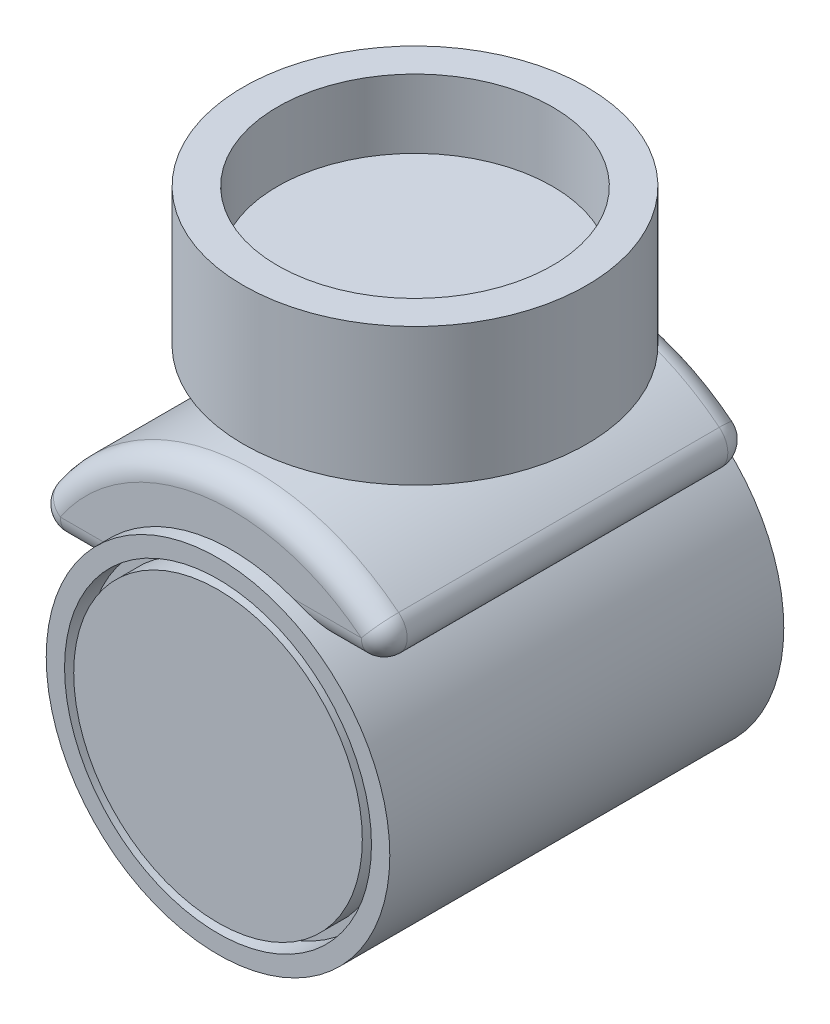
ISO-10303-21;
HEADER;
FILE_DESCRIPTION(('STEP AP214'),'2;1');
FILE_NAME('part.step','',(''),(''),'','','');
FILE_SCHEMA(('AUTOMOTIVE_DESIGN { 1 0 10303 214 1 1 1 1 }'));
ENDSEC;
DATA;
#1=APPLICATION_CONTEXT('core data for automotive mechanical design processes');
#2=APPLICATION_PROTOCOL_DEFINITION('international standard','automotive_design',2000,#1);
#3=PRODUCT_CONTEXT('',#1,'mechanical');
#4=PRODUCT('Part','Part','',(#3));
#5=PRODUCT_RELATED_PRODUCT_CATEGORY('part','',(#4));
#6=PRODUCT_DEFINITION_FORMATION('','',#4);
#7=PRODUCT_DEFINITION_CONTEXT('part definition',#1,'design');
#8=PRODUCT_DEFINITION('design','',#6,#7);
#9=PRODUCT_DEFINITION_SHAPE('','',#8);
#10=(LENGTH_UNIT() NAMED_UNIT(*) SI_UNIT(.MILLI.,.METRE.));
#11=(NAMED_UNIT(*) PLANE_ANGLE_UNIT() SI_UNIT($,.RADIAN.));
#12=(NAMED_UNIT(*) SI_UNIT($,.STERADIAN.) SOLID_ANGLE_UNIT());
#13=UNCERTAINTY_MEASURE_WITH_UNIT(LENGTH_MEASURE(1.E-05),#10,'distance_accuracy_value','');
#14=(GEOMETRIC_REPRESENTATION_CONTEXT(3) GLOBAL_UNCERTAINTY_ASSIGNED_CONTEXT((#13)) GLOBAL_UNIT_ASSIGNED_CONTEXT((#10,
#11,#12)) REPRESENTATION_CONTEXT('',''));
#15=CARTESIAN_POINT('',(0.,0.,0.));
#16=DIRECTION('',(0.,0.,1.));
#17=DIRECTION('',(1.,0.,0.));
#18=AXIS2_PLACEMENT_3D('',#15,#16,#17);
#19=CARTESIAN_POINT('',(0.,1.41257827102804,0.));
#20=DIRECTION('',(0.,1.,0.));
#21=DIRECTION('',(0.,0.,1.));
#22=AXIS2_PLACEMENT_3D('',#19,#20,#21);
#23=PLANE('',#22);
#24=CARTESIAN_POINT('',(0.,1.41257827102804,0.));
#25=DIRECTION('',(0.,1.,0.));
#26=DIRECTION('',(0.,0.,1.));
#27=AXIS2_PLACEMENT_3D('',#24,#25,#26);
#28=CIRCLE('',#27,3.81);
#29=CARTESIAN_POINT('',(0.,1.41257827102804,3.81));
#30=VERTEX_POINT('',#29);
#31=EDGE_CURVE('E389',#30,#30,#28,.F.);
#32=ORIENTED_EDGE('',*,*,#31,.F.);
#33=EDGE_LOOP('',(#32));
#34=FACE_BOUND('',#33,.T.);
#35=ADVANCED_FACE('F37',(#34),#23,.T.);
#36=CARTESIAN_POINT('',(0.,3.31757827102804,0.));
#37=DIRECTION('',(0.,1.,0.));
#38=DIRECTION('',(0.,0.,1.));
#39=AXIS2_PLACEMENT_3D('',#36,#37,#38);
#40=PLANE('',#39);
#41=CARTESIAN_POINT('',(0.,3.31757827102804,0.));
#42=DIRECTION('',(0.,1.,0.));
#43=DIRECTION('',(0.,0.,1.));
#44=AXIS2_PLACEMENT_3D('',#41,#42,#43);
#45=CIRCLE('',#44,4.7625);
#46=CARTESIAN_POINT('',(0.,3.31757827102804,4.7625));
#47=VERTEX_POINT('',#46);
#48=EDGE_CURVE('E386',#47,#47,#45,.T.);
#49=ORIENTED_EDGE('',*,*,#48,.T.);
#50=EDGE_LOOP('',(#49));
#51=FACE_BOUND('',#50,.T.);
#52=CARTESIAN_POINT('',(0.,3.31757827102804,0.));
#53=DIRECTION('',(0.,1.,0.));
#54=DIRECTION('',(0.,0.,1.));
#55=AXIS2_PLACEMENT_3D('',#52,#53,#54);
#56=CIRCLE('',#55,3.81);
#57=CARTESIAN_POINT('',(0.,3.31757827102804,3.81));
#58=VERTEX_POINT('',#57);
#59=EDGE_CURVE('E382',#58,#58,#56,.T.);
#60=ORIENTED_EDGE('',*,*,#59,.F.);
#61=EDGE_LOOP('',(#60));
#62=FACE_BOUND('',#61,.T.);
#63=ADVANCED_FACE('F324',(#51,#62),#40,.T.);
#64=CARTESIAN_POINT('',(0.,3.31757827102804,0.));
#65=DIRECTION('',(0.,-1.,0.));
#66=DIRECTION('',(0.,0.,-1.));
#67=AXIS2_PLACEMENT_3D('',#64,#65,#66);
#68=CYLINDRICAL_SURFACE('',#67,4.7625);
#69=ORIENTED_EDGE('',*,*,#48,.F.);
#70=EDGE_LOOP('',(#69));
#71=FACE_BOUND('',#70,.T.);
#72=CARTESIAN_POINT('',(0.,-0.492421728971962,0.));
#73=DIRECTION('',(0.,1.,0.));
#74=DIRECTION('',(0.,0.,1.));
#75=AXIS2_PLACEMENT_3D('',#72,#73,#74);
#76=CIRCLE('',#75,4.7625);
#77=CARTESIAN_POINT('',(0.,-0.492421728971962,4.7625));
#78=VERTEX_POINT('',#77);
#79=EDGE_CURVE('E385',#78,#78,#76,.T.);
#80=ORIENTED_EDGE('',*,*,#79,.T.);
#81=EDGE_LOOP('',(#80));
#82=FACE_BOUND('',#81,.T.);
#83=ADVANCED_FACE('F330',(#71,#82),#68,.T.);
#84=CARTESIAN_POINT('',(0.,3.31757827102804,0.));
#85=DIRECTION('',(0.,-1.,0.));
#86=DIRECTION('',(0.,0.,-1.));
#87=AXIS2_PLACEMENT_3D('',#84,#85,#86);
#88=CYLINDRICAL_SURFACE('',#87,3.81);
#89=ORIENTED_EDGE('',*,*,#31,.T.);
#90=EDGE_LOOP('',(#89));
#91=FACE_BOUND('',#90,.T.);
#92=ORIENTED_EDGE('',*,*,#59,.T.);
#93=EDGE_LOOP('',(#92));
#94=FACE_BOUND('',#93,.T.);
#95=ADVANCED_FACE('F340',(#91,#94),#88,.F.);
#96=CARTESIAN_POINT('',(0.,-0.492421728971962,0.));
#97=DIRECTION('',(0.,1.,0.));
#98=DIRECTION('',(0.,0.,1.));
#99=AXIS2_PLACEMENT_3D('',#96,#97,#98);
#100=PLANE('',#99);
#101=CARTESIAN_POINT('',(0.,-0.492421728971962,0.));
#102=DIRECTION('',(0.,1.,0.));
#103=DIRECTION('',(0.,0.,1.));
#104=AXIS2_PLACEMENT_3D('',#101,#102,#103);
#105=CIRCLE('',#104,2.04358610621043);
#106=CARTESIAN_POINT('',(0.,-0.492421728971962,2.04358610621043));
#107=VERTEX_POINT('',#106);
#108=EDGE_CURVE('E295',#107,#107,#105,.T.);
#109=ORIENTED_EDGE('',*,*,#108,.T.);
#110=EDGE_LOOP('',(#109));
#111=FACE_BOUND('',#110,.T.);
#112=ORIENTED_EDGE('',*,*,#79,.F.);
#113=EDGE_LOOP('',(#112));
#114=FACE_BOUND('',#113,.T.);
#115=ADVANCED_FACE('F336',(#111,#114),#100,.F.);
#116=CARTESIAN_POINT('',(0.,0.142578271028038,0.));
#117=DIRECTION('',(0.,1.,0.));
#118=DIRECTION('',(0.,0.,1.));
#119=AXIS2_PLACEMENT_3D('',#116,#117,#118);
#120=TOROIDAL_SURFACE('',#119,2.04358610621043,0.635);
#121=ORIENTED_EDGE('',*,*,#108,.F.);
#122=EDGE_LOOP('',(#121));
#123=FACE_BOUND('',#122,.T.);
#124=CARTESIAN_POINT('',(0.,-0.0161717289719625,0.));
#125=DIRECTION('',(0.,-1.,0.));
#126=DIRECTION('',(0.,0.,-1.));
#127=AXIS2_PLACEMENT_3D('',#124,#125,#126);
#128=CIRCLE('',#127,1.42875);
#129=CARTESIAN_POINT('',(0.,-0.0161717289719625,-1.42875));
#130=VERTEX_POINT('',#129);
#131=EDGE_CURVE('E303',#130,#130,#128,.T.);
#132=ORIENTED_EDGE('',*,*,#131,.F.);
#133=EDGE_LOOP('',(#132));
#134=FACE_BOUND('',#133,.T.);
#135=ADVANCED_FACE('F339',(#123,#134),#120,.T.);
#136=CARTESIAN_POINT('',(0.,-1.92117172897196,0.));
#137=DIRECTION('',(0.,1.,0.));
#138=DIRECTION('',(0.,0.,1.));
#139=AXIS2_PLACEMENT_3D('',#136,#137,#138);
#140=CYLINDRICAL_SURFACE('',#139,1.42875);
#141=CARTESIAN_POINT('',(0.,-1.28617172897196,1.42875));
#142=CARTESIAN_POINT('',(0.079184487410048,-1.28617317871178,1.42874737794598));
#143=CARTESIAN_POINT('',(0.158400172284176,-1.28766787062546,1.42214491756427));
#144=CARTESIAN_POINT('',(0.314577571088986,-1.29348604210137,1.39593923911504));
#145=CARTESIAN_POINT('',(0.391537700149918,-1.29781146314412,1.37632709811763));
#146=CARTESIAN_POINT('',(0.540924669135625,-1.3088099889122,1.32475049951203));
#147=CARTESIAN_POINT('',(0.613356284615451,-1.31548056962411,1.29279931835568));
#148=CARTESIAN_POINT('',(0.751828844070852,-1.3304513013143,1.21749465135513));
#149=CARTESIAN_POINT('',(0.817869878953762,-1.33875142910683,1.1741413277414));
#150=CARTESIAN_POINT('',(0.942806143313861,-1.35623058017428,1.07648694201246));
#151=CARTESIAN_POINT('',(1.0015777634772,-1.36542102684512,1.02202976956071));
#152=CARTESIAN_POINT('',(1.10923458535218,-1.38356540385516,0.90404849421199));
#153=CARTESIAN_POINT('',(1.15811886401439,-1.39251931204414,0.84052354572093));
#154=CARTESIAN_POINT('',(1.24516555001788,-1.40928989688758,0.705287285145301));
#155=CARTESIAN_POINT('',(1.28319509439951,-1.41709195989944,0.633488479346185));
#156=CARTESIAN_POINT('',(1.34660014071501,-1.43051097641353,0.48431439769387));
#157=CARTESIAN_POINT('',(1.3719772507002,-1.43612820757529,0.406939831918932));
#158=CARTESIAN_POINT('',(1.40894602258562,-1.44442499519974,0.250155124355456));
#159=CARTESIAN_POINT('',(1.4207572064714,-1.44715127527408,0.170799270654986));
#160=CARTESIAN_POINT('',(1.4309416660742,-1.44949771460732,0.011189165135652));
#161=CARTESIAN_POINT('',(1.4293166934006,-1.44911827874405,-0.0690649682164451));
#162=CARTESIAN_POINT('',(1.4128513355898,-1.44533840190995,-0.226552130330057));
#163=CARTESIAN_POINT('',(1.39826718800945,-1.44199653908706,-0.303813569077102));
#164=CARTESIAN_POINT('',(1.35670396060638,-1.43276110621595,-0.454764192545449));
#165=CARTESIAN_POINT('',(1.32972414922082,-1.42686738556429,-0.528453166144475));
#166=CARTESIAN_POINT('',(1.26390344121374,-1.41313534741333,-0.670881071496561));
#167=CARTESIAN_POINT('',(1.2249650815261,-1.40528115425365,-0.739573367836237));
#168=CARTESIAN_POINT('',(1.13640104831442,-1.38852272560462,-0.869543238061783));
#169=CARTESIAN_POINT('',(1.08677383804093,-1.37961833921104,-0.930819743789497));
#170=CARTESIAN_POINT('',(0.976889978192855,-1.36151237113748,-1.04569261436755));
#171=CARTESIAN_POINT('',(0.91641574316716,-1.3523086558386,-1.09908072357842));
#172=CARTESIAN_POINT('',(0.787266796258772,-1.33482658745563,-1.19499252173383));
#173=CARTESIAN_POINT('',(0.718591918613729,-1.32654825308312,-1.23751599101318));
#174=CARTESIAN_POINT('',(0.574728775633435,-1.31182031255665,-1.31054756028481));
#175=CARTESIAN_POINT('',(0.499525553848705,-1.30537505845475,-1.34102713161282));
#176=CARTESIAN_POINT('',(0.344887235719748,-1.29507165731759,-1.38885808420555));
#177=CARTESIAN_POINT('',(0.26545279343859,-1.29121311167387,-1.40621148824874));
#178=CARTESIAN_POINT('',(0.106392115533362,-1.28657504901594,-1.42699172950314));
#179=CARTESIAN_POINT('',(0.0268048044628994,-1.2857326846582,-1.43070287118437));
#180=CARTESIAN_POINT('',(-0.131852678167701,-1.28704523172584,-1.42486558261823));
#181=CARTESIAN_POINT('',(-0.210922886545386,-1.28919992737496,-1.41531810693811));
#182=CARTESIAN_POINT('',(-0.365350895903731,-1.29622470721696,-1.38347013066311));
#183=CARTESIAN_POINT('',(-0.440741271434964,-1.30106278086327,-1.36131989192198));
#184=CARTESIAN_POINT('',(-0.58673587298749,-1.31291227038694,-1.30506285778895));
#185=CARTESIAN_POINT('',(-0.657339674646352,-1.3199238786567,-1.27095500392288));
#186=CARTESIAN_POINT('',(-0.792924151524517,-1.33549697446209,-1.19116653199082));
#187=CARTESIAN_POINT('',(-0.857804869366608,-1.34408008490013,-1.14532037216637));
#188=CARTESIAN_POINT('',(-0.979053912321647,-1.36180206449007,-1.04357342758453));
#189=CARTESIAN_POINT('',(-1.03542106100022,-1.37094101020493,-0.987671255586817));
#190=CARTESIAN_POINT('',(-1.13917619274661,-1.38896351397175,-0.866091238970488));
#191=CARTESIAN_POINT('',(-1.1863667656488,-1.39783856852032,-0.800243426211712));
#192=CARTESIAN_POINT('',(-1.26902151993836,-1.41412494452591,-0.661390802006191));
#193=CARTESIAN_POINT('',(-1.30448621722063,-1.42153633037313,-0.58838630561017));
#194=CARTESIAN_POINT('',(-1.36243652383861,-1.43398293402914,-0.437688534568961));
#195=CARTESIAN_POINT('',(-1.38499651859401,-1.43903173891462,-0.360025042785157));
#196=CARTESIAN_POINT('',(-1.41671161769583,-1.44620424628798,-0.201880438485863));
#197=CARTESIAN_POINT('',(-1.42586901027283,-1.44832844809062,-0.121399809344135));
#198=CARTESIAN_POINT('',(-1.43041720693914,-1.44937848550419,0.0381008311621199));
#199=CARTESIAN_POINT('',(-1.42612144354633,-1.44837714209001,0.117111584900071));
#200=CARTESIAN_POINT('',(-1.40458914262178,-1.44345430722804,0.273252126740336));
#201=CARTESIAN_POINT('',(-1.38735277635815,-1.43953285442773,0.35038193972284));
#202=CARTESIAN_POINT('',(-1.34058391417646,-1.42924815297775,0.500304691758681));
#203=CARTESIAN_POINT('',(-1.31109955657724,-1.42289447131381,0.573113347808423));
#204=CARTESIAN_POINT('',(-1.24071211289213,-1.40845798072843,0.712796234529615));
#205=CARTESIAN_POINT('',(-1.19980775833223,-1.4003749797465,0.779669804874459));
#206=CARTESIAN_POINT('',(-1.1067127660161,-1.38317494937198,0.907123630146303));
#207=CARTESIAN_POINT('',(-1.05429984931835,-1.37403953063645,0.967539076828835));
#208=CARTESIAN_POINT('',(-0.940122799454479,-1.35588477089956,1.07881977449808));
#209=CARTESIAN_POINT('',(-0.878356499673578,-1.34686545731933,1.12968280663522));
#210=CARTESIAN_POINT('',(-0.746190524608135,-1.32981018683596,1.22109460861397));
#211=CARTESIAN_POINT('',(-0.675682752908773,-1.32178964591638,1.2614901382575));
#212=CARTESIAN_POINT('',(-0.528710515037693,-1.30779157857557,1.32979200010848));
#213=CARTESIAN_POINT('',(-0.452250969137706,-1.30181238616231,1.357708522508));
#214=CARTESIAN_POINT('',(-0.313126848632611,-1.29360331120409,1.39544034077278));
#215=CARTESIAN_POINT('',(-0.251199451816404,-1.29083407776903,1.40790705098194));
#216=CARTESIAN_POINT('',(-0.126187936171266,-1.28711775396837,1.42456272104245));
#217=CARTESIAN_POINT('',(-0.0631038746058487,-1.28617057364214,1.42875208957301));
#218=CARTESIAN_POINT('',(0.,-1.28617172897196,1.42875));
#219=B_SPLINE_CURVE_WITH_KNOTS('',3,(#141,#142,#143,#144,#145,#146,#147,#148,#149,#150,#151,
#152,#153,#154,#155,#156,#157,#158,#159,#160,#161,#162,#163,#164,#165,#166,#167,#168,#169,#170,
#171,#172,#173,#174,#175,#176,#177,#178,#179,#180,#181,#182,#183,#184,#185,#186,#187,#188,#189,
#190,#191,#192,#193,#194,#195,#196,#197,#198,#199,#200,#201,#202,#203,#204,#205,#206,#207,#208,
#209,#210,#211,#212,#213,#214,#215,#216,#217,#218),.UNSPECIFIED.,.T.,.F.,(4,2,2,2,2,2,2,2,2,2,2,
2,2,2,2,2,2,2,2,2,2,2,2,2,2,2,2,2,2,2,2,2,2,2,2,2,2,2,4),(0.,0.237322427459033,
0.474807795422124,0.712038344725914,0.949265518879734,1.19009167545273,1.43094030439084,
1.67462158048524,1.91827187819749,2.15792130609427,2.39753949250006,2.63252267489751,
2.86751972723017,3.10448526830179,3.34148490097479,3.58391739318978,3.8263547866041,
4.06936305326443,4.312333864049,4.55021150309433,4.78807201679229,5.02315424575875,
5.25825728918701,5.49687851236447,5.73553267893831,5.97885944380975,6.2221755017838,
6.4640745230958,6.70593224009044,6.94219741033046,7.1784594536702,7.41380157185504,
7.64916984102828,7.88956228324284,8.1300104953086,8.37380185404691,8.61739377068784,
8.80653061630404,8.99565812338732),.UNSPECIFIED.);
#220=CARTESIAN_POINT('',(0.,-1.28617172897196,1.42875));
#221=VERTEX_POINT('',#220);
#222=EDGE_CURVE('E296',#221,#221,#219,.T.);
#223=ORIENTED_EDGE('',*,*,#222,.T.);
#224=EDGE_LOOP('',(#223));
#225=FACE_BOUND('',#224,.T.);
#226=ORIENTED_EDGE('',*,*,#131,.T.);
#227=EDGE_LOOP('',(#226));
#228=FACE_BOUND('',#227,.T.);
#229=ADVANCED_FACE('F305',(#225,#228),#140,.T.);
#230=CARTESIAN_POINT('',(0.,-7.63617172897196,-5.08));
#231=DIRECTION('',(0.,0.,1.));
#232=DIRECTION('',(1.,0.,0.));
#233=AXIS2_PLACEMENT_3D('',#230,#231,#232);
#234=CYLINDRICAL_SURFACE('',#233,6.35);
#235=DIRECTION('',(0.,0.,1.));
#236=VECTOR('',#235,1.);
#237=CARTESIAN_POINT('',(-5.27989431244767,-4.10839395119418,-5.08));
#238=LINE('',#237,#236);
#239=CARTESIAN_POINT('',(-5.27989431244767,-4.10839395119418,-4.445));
#240=VERTEX_POINT('',#239);
#241=CARTESIAN_POINT('',(-5.27989431244767,-4.10839395119418,4.445));
#242=VERTEX_POINT('',#241);
#243=EDGE_CURVE('E251',#240,#242,#238,.T.);
#244=ORIENTED_EDGE('',*,*,#243,.T.);
#245=CARTESIAN_POINT('',(0.,-7.63617172897196,4.445));
#246=DIRECTION('',(0.,0.,1.));
#247=DIRECTION('',(1.,0.,0.));
#248=AXIS2_PLACEMENT_3D('',#245,#246,#247);
#249=CIRCLE('',#248,6.35);
#250=CARTESIAN_POINT('',(3.9912249426974,-2.69728284008307,4.445));
#251=VERTEX_POINT('',#250);
#252=EDGE_CURVE('E159',#242,#251,#249,.F.);
#253=ORIENTED_EDGE('',*,*,#252,.T.);
#254=DIRECTION('',(0.,0.,1.));
#255=VECTOR('',#254,1.);
#256=CARTESIAN_POINT('',(3.9912249426974,-2.69728284008307,-5.08));
#257=LINE('',#256,#255);
#258=CARTESIAN_POINT('',(3.9912249426974,-2.69728284008307,-4.445));
#259=VERTEX_POINT('',#258);
#260=EDGE_CURVE('E249',#251,#259,#257,.F.);
#261=ORIENTED_EDGE('',*,*,#260,.T.);
#262=CARTESIAN_POINT('',(0.,-7.63617172897196,-4.445));
#263=DIRECTION('',(0.,0.,1.));
#264=DIRECTION('',(1.,0.,0.));
#265=AXIS2_PLACEMENT_3D('',#262,#263,#264);
#266=CIRCLE('',#265,6.35);
#267=EDGE_CURVE('E241',#259,#240,#266,.T.);
#268=ORIENTED_EDGE('',*,*,#267,.T.);
#269=EDGE_LOOP('',(#244,#253,#261,#268));
#270=FACE_BOUND('',#269,.T.);
#271=ORIENTED_EDGE('',*,*,#222,.F.);
#272=EDGE_LOOP('',(#271));
#273=FACE_BOUND('',#272,.T.);
#274=ADVANCED_FACE('F247',(#270,#273),#234,.T.);
#275=CARTESIAN_POINT('',(5.08,-3.82617172897196,-5.08));
#276=DIRECTION('',(0.,-1.,0.));
#277=DIRECTION('',(1.,0.,0.));
#278=AXIS2_PLACEMENT_3D('',#275,#276,#277);
#279=PLANE('',#278);
#280=DIRECTION('',(0.,0.,1.));
#281=VECTOR('',#280,1.);
#282=CARTESIAN_POINT('',(3.59210244842766,-3.82617172897196,-5.08));
#283=LINE('',#282,#281);
#284=CARTESIAN_POINT('',(3.59210244842766,-3.82617172897196,-4.445));
#285=VERTEX_POINT('',#284);
#286=CARTESIAN_POINT('',(3.59210244842766,-3.82617172897196,4.445));
#287=VERTEX_POINT('',#286);
#288=EDGE_CURVE('E285',#285,#287,#283,.T.);
#289=ORIENTED_EDGE('',*,*,#288,.T.);
#290=DIRECTION('',(1.,0.,0.));
#291=VECTOR('',#290,1.);
#292=CARTESIAN_POINT('',(5.08,-3.82617172897196,4.445));
#293=LINE('',#292,#291);
#294=CARTESIAN_POINT('',(3.06185911661526,-3.82617172897196,4.445));
#295=VERTEX_POINT('',#294);
#296=EDGE_CURVE('E275',#287,#295,#293,.F.);
#297=ORIENTED_EDGE('',*,*,#296,.T.);
#298=DIRECTION('',(0.,0.,1.));
#299=VECTOR('',#298,1.);
#300=CARTESIAN_POINT('',(3.06185911661526,-3.82617172897196,-5.08));
#301=LINE('',#300,#299);
#302=CARTESIAN_POINT('',(3.06185911661526,-3.82617172897196,-4.445));
#303=VERTEX_POINT('',#302);
#304=EDGE_CURVE('E262',#295,#303,#301,.F.);
#305=ORIENTED_EDGE('',*,*,#304,.T.);
#306=DIRECTION('',(1.,0.,0.));
#307=VECTOR('',#306,1.);
#308=CARTESIAN_POINT('',(3.59210244842766,-3.82617172897196,-4.445));
#309=LINE('',#308,#307);
#310=EDGE_CURVE('E277',#303,#285,#309,.T.);
#311=ORIENTED_EDGE('',*,*,#310,.T.);
#312=EDGE_LOOP('',(#289,#297,#305,#311));
#313=FACE_BOUND('',#312,.T.);
#314=ADVANCED_FACE('F311',(#313),#279,.T.);
#315=CARTESIAN_POINT('',(-4.02862336909272,-5.09617172897196,-5.08));
#316=DIRECTION('',(0.,-1.,0.));
#317=DIRECTION('',(0.,0.,-1.));
#318=AXIS2_PLACEMENT_3D('',#315,#316,#317);
#319=PLANE('',#318);
#320=DIRECTION('',(0.,0.,1.));
#321=VECTOR('',#320,1.);
#322=CARTESIAN_POINT('',(-4.36490334944544,-5.09617172897196,-5.08));
#323=LINE('',#322,#321);
#324=CARTESIAN_POINT('',(-4.36490334944544,-5.09617172897196,-4.445));
#325=VERTEX_POINT('',#324);
#326=CARTESIAN_POINT('',(-4.36490334944544,-5.09617172897196,4.445));
#327=VERTEX_POINT('',#326);
#328=EDGE_CURVE('E291',#325,#327,#323,.T.);
#329=ORIENTED_EDGE('',*,*,#328,.T.);
#330=DIRECTION('',(1.,0.,0.));
#331=VECTOR('',#330,1.);
#332=CARTESIAN_POINT('',(-4.02862336909272,-5.09617172897196,4.445));
#333=LINE('',#332,#331);
#334=CARTESIAN_POINT('',(-4.7519048812029,-5.09617172897196,4.445));
#335=VERTEX_POINT('',#334);
#336=EDGE_CURVE('E228',#327,#335,#333,.F.);
#337=ORIENTED_EDGE('',*,*,#336,.T.);
#338=DIRECTION('',(0.,0.,1.));
#339=VECTOR('',#338,1.);
#340=CARTESIAN_POINT('',(-4.7519048812029,-5.09617172897196,-5.08));
#341=LINE('',#340,#339);
#342=CARTESIAN_POINT('',(-4.7519048812029,-5.09617172897196,-4.445));
#343=VERTEX_POINT('',#342);
#344=EDGE_CURVE('E293',#335,#343,#341,.F.);
#345=ORIENTED_EDGE('',*,*,#344,.T.);
#346=DIRECTION('',(1.,0.,0.));
#347=VECTOR('',#346,1.);
#348=CARTESIAN_POINT('',(-4.36490334944544,-5.09617172897196,-4.445));
#349=LINE('',#348,#347);
#350=EDGE_CURVE('E222',#343,#325,#349,.T.);
#351=ORIENTED_EDGE('',*,*,#350,.T.);
#352=EDGE_LOOP('',(#329,#337,#345,#351));
#353=FACE_BOUND('',#352,.T.);
#354=ADVANCED_FACE('F312',(#353),#319,.T.);
#355=CARTESIAN_POINT('',(0.,-7.63617172897196,-5.08));
#356=DIRECTION('',(0.,0.,1.));
#357=DIRECTION('',(1.,0.,0.));
#358=AXIS2_PLACEMENT_3D('',#355,#356,#357);
#359=PLANE('',#358);
#360=CARTESIAN_POINT('',(0.,-7.63617172897196,-5.08));
#361=DIRECTION('',(0.,0.,1.));
#362=DIRECTION('',(1.,0.,0.));
#363=AXIS2_PLACEMENT_3D('',#360,#361,#362);
#364=CIRCLE('',#363,5.715);
#365=CARTESIAN_POINT('',(-4.7519048812029,-4.46117172897196,-5.08));
#366=VERTEX_POINT('',#365);
#367=CARTESIAN_POINT('',(3.59210244842766,-3.19117172897196,-5.08));
#368=VERTEX_POINT('',#367);
#369=EDGE_CURVE('E55',#366,#368,#364,.F.);
#370=ORIENTED_EDGE('',*,*,#369,.T.);
#371=DIRECTION('',(1.,0.,0.));
#372=VECTOR('',#371,1.);
#373=CARTESIAN_POINT('',(3.06185911661527,-3.19117172897196,-5.08));
#374=LINE('',#373,#372);
#375=CARTESIAN_POINT('',(1.70978982626521,-3.19117172897196,-5.08));
#376=VERTEX_POINT('',#375);
#377=EDGE_CURVE('E239',#368,#376,#374,.F.);
#378=ORIENTED_EDGE('',*,*,#377,.T.);
#379=CARTESIAN_POINT('',(0.,-7.63617172897196,-5.08));
#380=DIRECTION('',(0.,0.,-1.));
#381=DIRECTION('',(1.,0.,0.));
#382=AXIS2_PLACEMENT_3D('',#379,#380,#381);
#383=CIRCLE('',#382,4.7625);
#384=CARTESIAN_POINT('',(-3.54975791428092,-4.46117172897196,-5.08));
#385=VERTEX_POINT('',#384);
#386=EDGE_CURVE('E150',#385,#376,#383,.T.);
#387=ORIENTED_EDGE('',*,*,#386,.F.);
#388=DIRECTION('',(1.,0.,0.));
#389=VECTOR('',#388,1.);
#390=CARTESIAN_POINT('',(-4.7519048812029,-4.46117172897196,-5.08));
#391=LINE('',#390,#389);
#392=EDGE_CURVE('E60',#385,#366,#391,.F.);
#393=ORIENTED_EDGE('',*,*,#392,.T.);
#394=EDGE_LOOP('',(#370,#378,#387,#393));
#395=FACE_BOUND('',#394,.T.);
#396=ADVANCED_FACE('F315',(#395),#359,.F.);
#397=CARTESIAN_POINT('',(0.,-7.63617172897196,5.08));
#398=DIRECTION('',(0.,0.,1.));
#399=DIRECTION('',(1.,0.,0.));
#400=AXIS2_PLACEMENT_3D('',#397,#398,#399);
#401=PLANE('',#400);
#402=CARTESIAN_POINT('',(0.,-7.63617172897196,5.08));
#403=DIRECTION('',(0.,0.,-1.));
#404=DIRECTION('',(1.,0.,0.));
#405=AXIS2_PLACEMENT_3D('',#402,#403,#404);
#406=CIRCLE('',#405,4.7625);
#407=CARTESIAN_POINT('',(-3.54975791428092,-4.46117172897196,5.08));
#408=VERTEX_POINT('',#407);
#409=CARTESIAN_POINT('',(1.7097898262652,-3.19117172897196,5.08));
#410=VERTEX_POINT('',#409);
#411=EDGE_CURVE('E132',#408,#410,#406,.T.);
#412=ORIENTED_EDGE('',*,*,#411,.T.);
#413=DIRECTION('',(1.,0.,0.));
#414=VECTOR('',#413,1.);
#415=CARTESIAN_POINT('',(0.,-3.19117172897196,5.08));
#416=LINE('',#415,#414);
#417=CARTESIAN_POINT('',(3.59210244842766,-3.19117172897196,5.08));
#418=VERTEX_POINT('',#417);
#419=EDGE_CURVE('E140',#410,#418,#416,.T.);
#420=ORIENTED_EDGE('',*,*,#419,.T.);
#421=CARTESIAN_POINT('',(0.,-7.63617172897196,5.08));
#422=DIRECTION('',(0.,0.,1.));
#423=DIRECTION('',(1.,0.,0.));
#424=AXIS2_PLACEMENT_3D('',#421,#422,#423);
#425=CIRCLE('',#424,5.715);
#426=CARTESIAN_POINT('',(-4.7519048812029,-4.46117172897196,5.08));
#427=VERTEX_POINT('',#426);
#428=EDGE_CURVE('E135',#418,#427,#425,.T.);
#429=ORIENTED_EDGE('',*,*,#428,.T.);
#430=DIRECTION('',(1.,0.,0.));
#431=VECTOR('',#430,1.);
#432=CARTESIAN_POINT('',(0.,-4.46117172897196,5.08));
#433=LINE('',#432,#431);
#434=EDGE_CURVE('E128',#427,#408,#433,.T.);
#435=ORIENTED_EDGE('',*,*,#434,.T.);
#436=EDGE_LOOP('',(#412,#420,#429,#435));
#437=FACE_BOUND('',#436,.T.);
#438=ADVANCED_FACE('F130',(#437),#401,.T.);
#439=CARTESIAN_POINT('',(-4.36490334944544,-4.46117172897196,-5.08));
#440=DIRECTION('',(0.,0.,1.));
#441=DIRECTION('',(1.,0.,0.));
#442=AXIS2_PLACEMENT_3D('',#439,#440,#441);
#443=CYLINDRICAL_SURFACE('',#442,0.635);
#444=DIRECTION('',(0.,0.,1.));
#445=VECTOR('',#444,1.);
#446=CARTESIAN_POINT('',(-3.85138530833421,-4.83470114073667,-5.08));
#447=LINE('',#446,#445);
#448=CARTESIAN_POINT('',(-3.85138530833421,-4.83470114073667,4.95851804111123));
#449=VERTEX_POINT('',#448);
#450=CARTESIAN_POINT('',(-3.85138530833421,-4.83470114073667,-4.95851804111123));
#451=VERTEX_POINT('',#450);
#452=EDGE_CURVE('E287',#449,#451,#447,.F.);
#453=ORIENTED_EDGE('',*,*,#452,.F.);
#454=CARTESIAN_POINT('',(-4.36490334944544,-4.46117172897196,4.445));
#455=DIRECTION('',(-0.707106781186547,0.,0.707106781186547));
#456=DIRECTION('',(0.707106781186547,0.,0.707106781186547));
#457=AXIS2_PLACEMENT_3D('',#454,#455,#456);
#458=ELLIPSE('',#457,0.898025612106915,0.635);
#459=EDGE_CURVE('E156',#449,#327,#458,.F.);
#460=ORIENTED_EDGE('',*,*,#459,.T.);
#461=ORIENTED_EDGE('',*,*,#328,.F.);
#462=CARTESIAN_POINT('',(-4.36490334944544,-4.46117172897196,-4.445));
#463=DIRECTION('',(0.707106781186547,0.,0.707106781186547));
#464=DIRECTION('',(-0.707106781186547,0.,0.707106781186547));
#465=AXIS2_PLACEMENT_3D('',#462,#463,#464);
#466=ELLIPSE('',#465,0.898025612106915,0.635);
#467=EDGE_CURVE('E223',#325,#451,#466,.T.);
#468=ORIENTED_EDGE('',*,*,#467,.T.);
#469=EDGE_LOOP('',(#453,#460,#461,#468));
#470=FACE_BOUND('',#469,.T.);
#471=ADVANCED_FACE('F322',(#470),#443,.T.);
#472=CARTESIAN_POINT('',(3.06185911661527,-3.19117172897196,-5.08));
#473=DIRECTION('',(0.,0.,1.));
#474=DIRECTION('',(1.,0.,0.));
#475=AXIS2_PLACEMENT_3D('',#472,#473,#474);
#476=CYLINDRICAL_SURFACE('',#475,0.635);
#477=ORIENTED_EDGE('',*,*,#304,.F.);
#478=CARTESIAN_POINT('',(3.06185911661527,-3.19117172897196,4.445));
#479=DIRECTION('',(0.707106781186547,0.,0.707106781186547));
#480=DIRECTION('',(-0.707106781186547,0.,0.707106781186547));
#481=AXIS2_PLACEMENT_3D('',#478,#479,#480);
#482=ELLIPSE('',#481,0.898025612106915,0.635);
#483=CARTESIAN_POINT('',(2.70164039701347,-3.71411290544255,4.8052187196018));
#484=VERTEX_POINT('',#483);
#485=EDGE_CURVE('E269',#295,#484,#482,.F.);
#486=ORIENTED_EDGE('',*,*,#485,.T.);
#487=DIRECTION('',(0.,0.,1.));
#488=VECTOR('',#487,1.);
#489=CARTESIAN_POINT('',(2.70164039701347,-3.71411290544255,-5.08));
#490=LINE('',#489,#488);
#491=CARTESIAN_POINT('',(2.70164039701347,-3.71411290544255,-4.8052187196018));
#492=VERTEX_POINT('',#491);
#493=EDGE_CURVE('E289',#492,#484,#490,.T.);
#494=ORIENTED_EDGE('',*,*,#493,.F.);
#495=CARTESIAN_POINT('',(3.06185911661527,-3.19117172897196,-4.445));
#496=DIRECTION('',(-0.707106781186547,0.,0.707106781186547));
#497=DIRECTION('',(0.707106781186547,0.,0.707106781186547));
#498=AXIS2_PLACEMENT_3D('',#495,#496,#497);
#499=ELLIPSE('',#498,0.898025612106915,0.635);
#500=EDGE_CURVE('E273',#492,#303,#499,.T.);
#501=ORIENTED_EDGE('',*,*,#500,.T.);
#502=EDGE_LOOP('',(#477,#486,#494,#501));
#503=FACE_BOUND('',#502,.T.);
#504=ADVANCED_FACE('F347',(#503),#476,.T.);
#505=CARTESIAN_POINT('',(-4.7519048812029,-4.46117172897196,-5.08));
#506=DIRECTION('',(0.,0.,1.));
#507=DIRECTION('',(1.,0.,0.));
#508=AXIS2_PLACEMENT_3D('',#505,#506,#507);
#509=CYLINDRICAL_SURFACE('',#508,0.635);
#510=ORIENTED_EDGE('',*,*,#344,.F.);
#511=CARTESIAN_POINT('',(-4.7519048812029,-4.46117172897196,4.445));
#512=DIRECTION('',(0.,0.,1.));
#513=DIRECTION('',(1.,0.,0.));
#514=AXIS2_PLACEMENT_3D('',#511,#512,#513);
#515=CIRCLE('',#514,0.635);
#516=EDGE_CURVE('E235',#335,#242,#515,.F.);
#517=ORIENTED_EDGE('',*,*,#516,.T.);
#518=ORIENTED_EDGE('',*,*,#243,.F.);
#519=CARTESIAN_POINT('',(-4.7519048812029,-4.46117172897196,-4.445));
#520=DIRECTION('',(0.,0.,1.));
#521=DIRECTION('',(1.,0.,0.));
#522=AXIS2_PLACEMENT_3D('',#519,#520,#521);
#523=CIRCLE('',#522,0.635);
#524=EDGE_CURVE('E217',#240,#343,#523,.T.);
#525=ORIENTED_EDGE('',*,*,#524,.T.);
#526=EDGE_LOOP('',(#510,#517,#518,#525));
#527=FACE_BOUND('',#526,.T.);
#528=ADVANCED_FACE('F351',(#527),#509,.T.);
#529=CARTESIAN_POINT('',(3.59210244842766,-3.19117172897196,-5.08));
#530=DIRECTION('',(0.,0.,1.));
#531=DIRECTION('',(1.,0.,0.));
#532=AXIS2_PLACEMENT_3D('',#529,#530,#531);
#533=CYLINDRICAL_SURFACE('',#532,0.635);
#534=ORIENTED_EDGE('',*,*,#260,.F.);
#535=CARTESIAN_POINT('',(3.59210244842766,-3.19117172897196,4.445));
#536=DIRECTION('',(0.,0.,1.));
#537=DIRECTION('',(1.,0.,0.));
#538=AXIS2_PLACEMENT_3D('',#535,#536,#537);
#539=CIRCLE('',#538,0.635);
#540=EDGE_CURVE('E258',#251,#287,#539,.F.);
#541=ORIENTED_EDGE('',*,*,#540,.T.);
#542=ORIENTED_EDGE('',*,*,#288,.F.);
#543=CARTESIAN_POINT('',(3.59210244842766,-3.19117172897196,-4.445));
#544=DIRECTION('',(0.,0.,1.));
#545=DIRECTION('',(1.,0.,0.));
#546=AXIS2_PLACEMENT_3D('',#543,#544,#545);
#547=CIRCLE('',#546,0.635);
#548=EDGE_CURVE('E261',#285,#259,#547,.T.);
#549=ORIENTED_EDGE('',*,*,#548,.T.);
#550=EDGE_LOOP('',(#534,#541,#542,#549));
#551=FACE_BOUND('',#550,.T.);
#552=ADVANCED_FACE('F182',(#551),#533,.T.);
#553=CARTESIAN_POINT('',(0.,-7.63617172897196,-5.461));
#554=DIRECTION('',(0.,0.,1.));
#555=DIRECTION('',(1.,0.,0.));
#556=AXIS2_PLACEMENT_3D('',#553,#554,#555);
#557=CYLINDRICAL_SURFACE('',#556,4.7625);
#558=CARTESIAN_POINT('',(0.,-7.63617172897196,5.461));
#559=DIRECTION('',(0.,0.,1.));
#560=DIRECTION('',(1.,0.,0.));
#561=AXIS2_PLACEMENT_3D('',#558,#559,#560);
#562=CIRCLE('',#561,4.7625);
#563=CARTESIAN_POINT('',(4.7625,-7.63617172897196,5.461));
#564=VERTEX_POINT('',#563);
#565=EDGE_CURVE('E649',#564,#564,#562,.T.);
#566=ORIENTED_EDGE('',*,*,#565,.F.);
#567=EDGE_LOOP('',(#566));
#568=FACE_BOUND('',#567,.T.);
#569=CARTESIAN_POINT('',(0.,-7.63617172897196,-5.461));
#570=DIRECTION('',(0.,0.,1.));
#571=DIRECTION('',(1.,0.,0.));
#572=AXIS2_PLACEMENT_3D('',#569,#570,#571);
#573=CIRCLE('',#572,4.7625);
#574=CARTESIAN_POINT('',(4.7625,-7.63617172897196,-5.461));
#575=VERTEX_POINT('',#574);
#576=EDGE_CURVE('E151',#575,#575,#573,.T.);
#577=ORIENTED_EDGE('',*,*,#576,.T.);
#578=EDGE_LOOP('',(#577));
#579=FACE_BOUND('',#578,.T.);
#580=ORIENTED_EDGE('',*,*,#411,.F.);
#581=CARTESIAN_POINT('',(-3.54975791428092,-4.46117172897196,5.08));
#582=CARTESIAN_POINT('',(-3.58599306842051,-4.50162106624736,5.08000288398322));
#583=CARTESIAN_POINT('',(-3.62162131249339,-4.54290977770361,5.07612431658454));
#584=CARTESIAN_POINT('',(-3.68982344438081,-4.62464809623115,5.05997789909676));
#585=CARTESIAN_POINT('',(-3.72244946947347,-4.66509459209691,5.04790956041287));
#586=CARTESIAN_POINT('',(-3.77081562145016,-4.72702080206334,5.02216763579267));
#587=CARTESIAN_POINT('',(-3.78762475086549,-4.74895311452655,5.01158238722329));
#588=CARTESIAN_POINT('',(-3.82032084796425,-4.79235300712037,4.98737448435319));
#589=CARTESIAN_POINT('',(-3.83619251099608,-4.813810475754,4.97371317117921));
#590=CARTESIAN_POINT('',(-3.85138530833421,-4.83470114073667,4.95851804111123));
#591=B_SPLINE_CURVE_WITH_KNOTS('',3,(#581,#582,#583,#584,#585,#586,#587,#588,#589,#590),
.UNSPECIFIED.,.F.,.F.,(4,2,2,2,4),(0.,0.163131199626617,0.322424603967217,0.411036949883696,
0.500832143116866),.UNSPECIFIED.);
#592=EDGE_CURVE('E145',#408,#449,#591,.T.);
#593=ORIENTED_EDGE('',*,*,#592,.T.);
#594=ORIENTED_EDGE('',*,*,#452,.T.);
#595=CARTESIAN_POINT('',(-3.85138530833421,-4.83470114073667,-4.95851804111123));
#596=CARTESIAN_POINT('',(-3.83745442916627,-4.81554621221726,-4.97244773194295));
#597=CARTESIAN_POINT('',(-3.8229571638488,-4.79591981374784,-4.98508913465405));
#598=CARTESIAN_POINT('',(-3.7929846434327,-4.75601671844051,-5.00786714726233));
#599=CARTESIAN_POINT('',(-3.77751069175155,-4.73574090535934,-5.01800701035071));
#600=CARTESIAN_POINT('',(-3.73051879939128,-4.67522754581781,-5.04442598197489));
#601=CARTESIAN_POINT('',(-3.69778741190388,-4.63441294233133,-5.05732424451306));
#602=CARTESIAN_POINT('',(-3.64562738236891,-4.57159293284107,-5.07073608954124));
#603=CARTESIAN_POINT('',(-3.62695157927764,-4.54951166725131,-5.07421554735551));
#604=CARTESIAN_POINT('',(-3.58884520075598,-4.50528388530011,-5.07885865967556));
#605=CARTESIAN_POINT('',(-3.56940820086245,-4.48313985304745,-5.07999357600229));
#606=CARTESIAN_POINT('',(-3.54975791428093,-4.46117172897198,-5.08000000000013));
#607=B_SPLINE_CURVE_WITH_KNOTS('',3,(#595,#596,#597,#598,#599,#600,#601,#602,#603,#604,#605,
#606),.UNSPECIFIED.,.F.,.F.,(4,2,2,2,2,4),(0.,0.0823303129561111,0.164552986163358,
0.325273547363079,0.412580853072867,0.500952125810101),.UNSPECIFIED.);
#608=EDGE_CURVE('E11',#451,#385,#607,.T.);
#609=ORIENTED_EDGE('',*,*,#608,.T.);
#610=ORIENTED_EDGE('',*,*,#386,.T.);
#611=CARTESIAN_POINT('',(1.70978982626521,-3.19117172897196,-5.08));
#612=CARTESIAN_POINT('',(1.74320396023671,-3.20402461460586,-5.07999803048444));
#613=CARTESIAN_POINT('',(1.77647163025425,-3.2172538999561,-5.07961012735485));
#614=CARTESIAN_POINT('',(1.84269442330887,-3.24445609167481,-5.07790750713626));
#615=CARTESIAN_POINT('',(1.87564939862458,-3.25842933071693,-5.07659237214389));
#616=CARTESIAN_POINT('',(1.97451953243924,-3.30167329793511,-5.07099283101234));
#617=CARTESIAN_POINT('',(2.03987895446543,-3.33205256623555,-5.06504898124739));
#618=CARTESIAN_POINT('',(2.16520274854499,-3.39377542341882,-5.04762072875726));
#619=CARTESIAN_POINT('',(2.22527147357806,-3.42498834179245,-5.03643808186282));
#620=CARTESIAN_POINT('',(2.34251351353214,-3.48906788336367,-5.006896870906));
#621=CARTESIAN_POINT('',(2.39969650090237,-3.5219281277488,-4.988564366011));
#622=CARTESIAN_POINT('',(2.49946196155275,-3.58193806985395,-4.94659786834035));
#623=CARTESIAN_POINT('',(2.54276408947991,-3.60899593359396,-4.92461583270164));
#624=CARTESIAN_POINT('',(2.60483845063073,-3.64908640766279,-4.88533795243085));
#625=CARTESIAN_POINT('',(2.62523924447676,-3.66249881282068,-4.87101834324101));
#626=CARTESIAN_POINT('',(2.66461531885287,-3.68879271048709,-4.83998082281597));
#627=CARTESIAN_POINT('',(2.68358616656726,-3.70167250033952,-4.82325588639457));
#628=CARTESIAN_POINT('',(2.7016403970137,-3.71411290544269,-4.80521871960254));
#629=B_SPLINE_CURVE_WITH_KNOTS('',3,(#611,#612,#613,#614,#615,#616,#617,#618,#619,#620,#621,
#622,#623,#624,#625,#626,#627,#628),.UNSPECIFIED.,.F.,.F.,(4,2,2,2,2,2,2,2,4),(0.,
0.107392976675063,0.214834386326664,0.431516186062103,0.637015886623208,0.841773496151754,
1.00791365196358,1.09269855262889,1.17773631061106),.UNSPECIFIED.);
#630=EDGE_CURVE('E47',#376,#492,#629,.T.);
#631=ORIENTED_EDGE('',*,*,#630,.T.);
#632=ORIENTED_EDGE('',*,*,#493,.T.);
#633=CARTESIAN_POINT('',(2.70164039701347,-3.71411290544255,4.8052187196018));
#634=CARTESIAN_POINT('',(2.68427300014515,-3.70214637985051,4.82257156197773));
#635=CARTESIAN_POINT('',(2.66605555863533,-3.68977116476349,4.83870918373286));
#636=CARTESIAN_POINT('',(2.62827991144484,-3.66451464160946,4.86874299271909));
#637=CARTESIAN_POINT('',(2.60872568836777,-3.65163488179612,4.88264545697624));
#638=CARTESIAN_POINT('',(2.548967869064,-3.61294001200324,4.92107741336955));
#639=CARTESIAN_POINT('',(2.50719483870382,-3.58673931699711,4.94277583584879));
#640=CARTESIAN_POINT('',(2.42788554099462,-3.53878470362209,4.97708326824841));
#641=CARTESIAN_POINT('',(2.39074104611955,-3.51699015305854,4.99059116681267));
#642=CARTESIAN_POINT('',(2.31502716036953,-3.47396630819643,5.01407928251782));
#643=CARTESIAN_POINT('',(2.2764571290845,-3.45273727550567,5.02405789234681));
#644=CARTESIAN_POINT('',(2.15843739429978,-3.38993573565415,5.04980592623556));
#645=CARTESIAN_POINT('',(2.07733124994439,-3.3496464450032,5.06113395033429));
#646=CARTESIAN_POINT('',(1.94788260267037,-3.2899244369588,5.07265848596555));
#647=CARTESIAN_POINT('',(1.90041099208623,-3.26895899641438,5.0755455816465));
#648=CARTESIAN_POINT('',(1.8053181937274,-3.22880773356313,5.07919849662705));
#649=CARTESIAN_POINT('',(1.75770586085276,-3.20960335499149,5.07998970987765));
#650=CARTESIAN_POINT('',(1.7097898262652,-3.19117172897196,5.08));
#651=B_SPLINE_CURVE_WITH_KNOTS('',3,(#633,#634,#635,#636,#637,#638,#639,#640,#641,#642,#643,
#644,#645,#646,#647,#648,#649,#650),.UNSPECIFIED.,.F.,.F.,(4,2,2,2,2,2,2,2,4),(0.,
0.0818131223910532,0.163392315493196,0.324394234672088,0.459631174980284,0.594929625952472,
0.867918820486484,1.02379832972212,1.17778035804748),.UNSPECIFIED.);
#652=EDGE_CURVE('E149',#484,#410,#651,.T.);
#653=ORIENTED_EDGE('',*,*,#652,.T.);
#654=EDGE_LOOP('',(#580,#593,#594,#609,#610,#631,#632,#653));
#655=FACE_BOUND('',#654,.T.);
#656=ADVANCED_FACE('F143',(#568,#579,#655),#557,.T.);
#657=CARTESIAN_POINT('',(0.,-7.63617172897196,-5.461));
#658=DIRECTION('',(0.,0.,1.));
#659=DIRECTION('',(1.,0.,0.));
#660=AXIS2_PLACEMENT_3D('',#657,#658,#659);
#661=PLANE('',#660);
#662=CARTESIAN_POINT('',(0.,-7.63617172897196,-5.461));
#663=DIRECTION('',(0.,0.,-1.));
#664=DIRECTION('',(-1.,0.,0.));
#665=AXIS2_PLACEMENT_3D('',#662,#663,#664);
#666=CIRCLE('',#665,4.2545);
#667=CARTESIAN_POINT('',(-4.2545,-7.63617172897196,-5.461));
#668=VERTEX_POINT('',#667);
#669=EDGE_CURVE('E645',#668,#668,#666,.T.);
#670=ORIENTED_EDGE('',*,*,#669,.F.);
#671=EDGE_LOOP('',(#670));
#672=FACE_BOUND('',#671,.T.);
#673=ORIENTED_EDGE('',*,*,#576,.F.);
#674=EDGE_LOOP('',(#673));
#675=FACE_BOUND('',#674,.T.);
#676=ADVANCED_FACE('F181',(#672,#675),#661,.F.);
#677=CARTESIAN_POINT('',(0.,-7.63617172897196,5.461));
#678=DIRECTION('',(0.,0.,1.));
#679=DIRECTION('',(1.,0.,0.));
#680=AXIS2_PLACEMENT_3D('',#677,#678,#679);
#681=PLANE('',#680);
#682=CARTESIAN_POINT('',(0.,-7.63617172897196,5.461));
#683=DIRECTION('',(0.,0.,-1.));
#684=DIRECTION('',(-1.,0.,0.));
#685=AXIS2_PLACEMENT_3D('',#682,#683,#684);
#686=CIRCLE('',#685,4.2545);
#687=CARTESIAN_POINT('',(-4.2545,-7.63617172897196,5.461));
#688=VERTEX_POINT('',#687);
#689=EDGE_CURVE('E664',#688,#688,#686,.T.);
#690=ORIENTED_EDGE('',*,*,#689,.T.);
#691=EDGE_LOOP('',(#690));
#692=FACE_BOUND('',#691,.T.);
#693=ORIENTED_EDGE('',*,*,#565,.T.);
#694=EDGE_LOOP('',(#693));
#695=FACE_BOUND('',#694,.T.);
#696=ADVANCED_FACE('F558',(#692,#695),#681,.T.);
#697=CARTESIAN_POINT('',(0.,-7.63617172897196,-4.826));
#698=DIRECTION('',(0.,0.,-1.));
#699=DIRECTION('',(-1.,0.,0.));
#700=AXIS2_PLACEMENT_3D('',#697,#698,#699);
#701=CYLINDRICAL_SURFACE('',#700,4.2545);
#702=CARTESIAN_POINT('',(0.,-7.63617172897196,-4.826));
#703=DIRECTION('',(0.,0.,-1.));
#704=DIRECTION('',(-1.,0.,0.));
#705=AXIS2_PLACEMENT_3D('',#702,#703,#704);
#706=CIRCLE('',#705,4.2545);
#707=CARTESIAN_POINT('',(-4.2545,-7.63617172897196,-4.826));
#708=VERTEX_POINT('',#707);
#709=EDGE_CURVE('E651',#708,#708,#706,.T.);
#710=ORIENTED_EDGE('',*,*,#709,.F.);
#711=EDGE_LOOP('',(#710));
#712=FACE_BOUND('',#711,.T.);
#713=ORIENTED_EDGE('',*,*,#669,.T.);
#714=EDGE_LOOP('',(#713));
#715=FACE_BOUND('',#714,.T.);
#716=ADVANCED_FACE('F603',(#712,#715),#701,.F.);
#717=CARTESIAN_POINT('',(0.,-7.63617172897196,-4.826));
#718=DIRECTION('',(0.,0.,-1.));
#719=DIRECTION('',(-1.,0.,0.));
#720=AXIS2_PLACEMENT_3D('',#717,#718,#719);
#721=PLANE('',#720);
#722=CARTESIAN_POINT('',(0.,-7.63617172897196,-4.826));
#723=DIRECTION('',(0.,0.,-1.));
#724=DIRECTION('',(-1.,0.,0.));
#725=AXIS2_PLACEMENT_3D('',#722,#723,#724);
#726=CIRCLE('',#725,4.0005);
#727=CARTESIAN_POINT('',(-4.0005,-7.63617172897196,-4.826));
#728=VERTEX_POINT('',#727);
#729=EDGE_CURVE('E655',#728,#728,#726,.T.);
#730=ORIENTED_EDGE('',*,*,#729,.F.);
#731=EDGE_LOOP('',(#730));
#732=FACE_BOUND('',#731,.T.);
#733=ORIENTED_EDGE('',*,*,#709,.T.);
#734=EDGE_LOOP('',(#733));
#735=FACE_BOUND('',#734,.T.);
#736=ADVANCED_FACE('F595',(#732,#735),#721,.T.);
#737=CARTESIAN_POINT('',(0.,-7.63617172897196,-4.826));
#738=DIRECTION('',(0.,0.,-1.));
#739=DIRECTION('',(-1.,0.,0.));
#740=AXIS2_PLACEMENT_3D('',#737,#738,#739);
#741=CYLINDRICAL_SURFACE('',#740,4.0005);
#742=ORIENTED_EDGE('',*,*,#729,.T.);
#743=EDGE_LOOP('',(#742));
#744=FACE_BOUND('',#743,.T.);
#745=CARTESIAN_POINT('',(0.,-7.63617172897196,-5.461));
#746=DIRECTION('',(0.,0.,-1.));
#747=DIRECTION('',(-1.,0.,0.));
#748=AXIS2_PLACEMENT_3D('',#745,#746,#747);
#749=CIRCLE('',#748,4.0005);
#750=CARTESIAN_POINT('',(-4.0005,-7.63617172897196,-5.461));
#751=VERTEX_POINT('',#750);
#752=EDGE_CURVE('E658',#751,#751,#749,.T.);
#753=ORIENTED_EDGE('',*,*,#752,.F.);
#754=EDGE_LOOP('',(#753));
#755=FACE_BOUND('',#754,.T.);
#756=ADVANCED_FACE('F588',(#744,#755),#741,.T.);
#757=ORIENTED_EDGE('',*,*,#752,.T.);
#758=EDGE_LOOP('',(#757));
#759=FACE_BOUND('',#758,.T.);
#760=ADVANCED_FACE('F579',(#759),#661,.F.);
#761=CARTESIAN_POINT('',(0.,-7.63617172897196,4.826));
#762=DIRECTION('',(0.,0.,1.));
#763=DIRECTION('',(-1.,0.,0.));
#764=AXIS2_PLACEMENT_3D('',#761,#762,#763);
#765=PLANE('',#764);
#766=CARTESIAN_POINT('',(0.,-7.63617172897196,4.826));
#767=DIRECTION('',(0.,0.,-1.));
#768=DIRECTION('',(-1.,0.,0.));
#769=AXIS2_PLACEMENT_3D('',#766,#767,#768);
#770=CIRCLE('',#769,4.2545);
#771=CARTESIAN_POINT('',(-4.2545,-7.63617172897196,4.826));
#772=VERTEX_POINT('',#771);
#773=EDGE_CURVE('E661',#772,#772,#770,.T.);
#774=ORIENTED_EDGE('',*,*,#773,.F.);
#775=EDGE_LOOP('',(#774));
#776=FACE_BOUND('',#775,.T.);
#777=CARTESIAN_POINT('',(0.,-7.63617172897196,4.826));
#778=DIRECTION('',(0.,0.,-1.));
#779=DIRECTION('',(-1.,0.,0.));
#780=AXIS2_PLACEMENT_3D('',#777,#778,#779);
#781=CIRCLE('',#780,4.0005);
#782=CARTESIAN_POINT('',(-4.0005,-7.63617172897196,4.826));
#783=VERTEX_POINT('',#782);
#784=EDGE_CURVE('E667',#783,#783,#781,.T.);
#785=ORIENTED_EDGE('',*,*,#784,.T.);
#786=EDGE_LOOP('',(#785));
#787=FACE_BOUND('',#786,.T.);
#788=ADVANCED_FACE('F571',(#776,#787),#765,.T.);
#789=CARTESIAN_POINT('',(0.,-7.63617172897196,4.826));
#790=DIRECTION('',(0.,0.,1.));
#791=DIRECTION('',(1.,0.,0.));
#792=AXIS2_PLACEMENT_3D('',#789,#790,#791);
#793=CYLINDRICAL_SURFACE('',#792,4.2545);
#794=ORIENTED_EDGE('',*,*,#773,.T.);
#795=EDGE_LOOP('',(#794));
#796=FACE_BOUND('',#795,.T.);
#797=ORIENTED_EDGE('',*,*,#689,.F.);
#798=EDGE_LOOP('',(#797));
#799=FACE_BOUND('',#798,.T.);
#800=ADVANCED_FACE('F564',(#796,#799),#793,.F.);
#801=CARTESIAN_POINT('',(0.,-7.63617172897196,4.826));
#802=DIRECTION('',(0.,0.,1.));
#803=DIRECTION('',(1.,0.,0.));
#804=AXIS2_PLACEMENT_3D('',#801,#802,#803);
#805=CYLINDRICAL_SURFACE('',#804,4.0005);
#806=ORIENTED_EDGE('',*,*,#784,.F.);
#807=EDGE_LOOP('',(#806));
#808=FACE_BOUND('',#807,.T.);
#809=CARTESIAN_POINT('',(0.,-7.63617172897196,5.461));
#810=DIRECTION('',(0.,0.,-1.));
#811=DIRECTION('',(-1.,0.,0.));
#812=AXIS2_PLACEMENT_3D('',#809,#810,#811);
#813=CIRCLE('',#812,4.0005);
#814=CARTESIAN_POINT('',(-4.0005,-7.63617172897196,5.461));
#815=VERTEX_POINT('',#814);
#816=EDGE_CURVE('E203',#815,#815,#813,.T.);
#817=ORIENTED_EDGE('',*,*,#816,.T.);
#818=EDGE_LOOP('',(#817));
#819=FACE_BOUND('',#818,.T.);
#820=ADVANCED_FACE('F556',(#808,#819),#805,.T.);
#821=ORIENTED_EDGE('',*,*,#816,.F.);
#822=EDGE_LOOP('',(#821));
#823=FACE_BOUND('',#822,.T.);
#824=ADVANCED_FACE('F371',(#823),#681,.T.);
#825=CARTESIAN_POINT('',(0.,-4.46117172897196,4.445));
#826=DIRECTION('',(1.,0.,0.));
#827=DIRECTION('',(0.,0.,-1.));
#828=AXIS2_PLACEMENT_3D('',#825,#826,#827);
#829=CYLINDRICAL_SURFACE('',#828,0.635);
#830=CARTESIAN_POINT('',(-4.7519048812029,-4.46117172897196,4.445));
#831=DIRECTION('',(-1.,0.,0.));
#832=DIRECTION('',(0.,0.,1.));
#833=AXIS2_PLACEMENT_3D('',#830,#831,#832);
#834=CIRCLE('',#833,0.635);
#835=EDGE_CURVE('E201',#335,#427,#834,.T.);
#836=ORIENTED_EDGE('',*,*,#835,.F.);
#837=ORIENTED_EDGE('',*,*,#336,.F.);
#838=ORIENTED_EDGE('',*,*,#459,.F.);
#839=ORIENTED_EDGE('',*,*,#592,.F.);
#840=ORIENTED_EDGE('',*,*,#434,.F.);
#841=EDGE_LOOP('',(#836,#837,#838,#839,#840));
#842=FACE_BOUND('',#841,.T.);
#843=ADVANCED_FACE('F154',(#842),#829,.T.);
#844=CARTESIAN_POINT('',(-4.7519048812029,-4.46117172897196,4.445));
#845=DIRECTION('',(0.,0.,1.));
#846=DIRECTION('',(1.,0.,0.));
#847=AXIS2_PLACEMENT_3D('',#844,#845,#846);
#848=SPHERICAL_SURFACE('',#847,0.635);
#849=ORIENTED_EDGE('',*,*,#516,.F.);
#850=ORIENTED_EDGE('',*,*,#835,.T.);
#851=CARTESIAN_POINT('',(-4.7519048812029,-4.46117172897196,4.445));
#852=DIRECTION('',(0.555555555555556,0.831479419283098,0.));
#853=DIRECTION('',(-0.831479419283098,0.555555555555556,0.));
#854=AXIS2_PLACEMENT_3D('',#851,#852,#853);
#855=CIRCLE('',#854,0.635);
#856=EDGE_CURVE('E198',#242,#427,#855,.T.);
#857=ORIENTED_EDGE('',*,*,#856,.F.);
#858=EDGE_LOOP('',(#849,#850,#857));
#859=FACE_BOUND('',#858,.T.);
#860=ADVANCED_FACE('F365',(#859),#848,.T.);
#861=CARTESIAN_POINT('',(0.,-7.63617172897196,4.445));
#862=DIRECTION('',(0.,0.,1.));
#863=DIRECTION('',(1.,0.,0.));
#864=AXIS2_PLACEMENT_3D('',#861,#862,#863);
#865=TOROIDAL_SURFACE('',#864,5.715,0.635);
#866=CARTESIAN_POINT('',(3.59210244842766,-3.19117172897196,4.445));
#867=DIRECTION('',(0.777777777777778,-0.628539361054709,0.));
#868=DIRECTION('',(0.628539361054709,0.777777777777778,0.));
#869=AXIS2_PLACEMENT_3D('',#866,#867,#868);
#870=CIRCLE('',#869,0.635);
#871=EDGE_CURVE('E195',#251,#418,#870,.T.);
#872=ORIENTED_EDGE('',*,*,#871,.F.);
#873=ORIENTED_EDGE('',*,*,#252,.F.);
#874=ORIENTED_EDGE('',*,*,#856,.T.);
#875=ORIENTED_EDGE('',*,*,#428,.F.);
#876=EDGE_LOOP('',(#872,#873,#874,#875));
#877=FACE_BOUND('',#876,.T.);
#878=ADVANCED_FACE('F264',(#877),#865,.T.);
#879=CARTESIAN_POINT('',(3.59210244842766,-3.19117172897196,4.445));
#880=DIRECTION('',(0.,0.,1.));
#881=DIRECTION('',(1.,0.,0.));
#882=AXIS2_PLACEMENT_3D('',#879,#880,#881);
#883=SPHERICAL_SURFACE('',#882,0.635);
#884=ORIENTED_EDGE('',*,*,#540,.F.);
#885=ORIENTED_EDGE('',*,*,#871,.T.);
#886=CARTESIAN_POINT('',(3.59210244842766,-3.19117172897196,4.445));
#887=DIRECTION('',(-1.,0.,0.));
#888=DIRECTION('',(0.,-1.,0.));
#889=AXIS2_PLACEMENT_3D('',#886,#887,#888);
#890=CIRCLE('',#889,0.635);
#891=EDGE_CURVE('E193',#287,#418,#890,.T.);
#892=ORIENTED_EDGE('',*,*,#891,.F.);
#893=EDGE_LOOP('',(#884,#885,#892));
#894=FACE_BOUND('',#893,.T.);
#895=ADVANCED_FACE('F267',(#894),#883,.T.);
#896=CARTESIAN_POINT('',(0.,-3.19117172897196,4.445));
#897=DIRECTION('',(1.,0.,0.));
#898=DIRECTION('',(0.,1.,0.));
#899=AXIS2_PLACEMENT_3D('',#896,#897,#898);
#900=CYLINDRICAL_SURFACE('',#899,0.635);
#901=ORIENTED_EDGE('',*,*,#485,.F.);
#902=ORIENTED_EDGE('',*,*,#296,.F.);
#903=ORIENTED_EDGE('',*,*,#891,.T.);
#904=ORIENTED_EDGE('',*,*,#419,.F.);
#905=ORIENTED_EDGE('',*,*,#652,.F.);
#906=EDGE_LOOP('',(#901,#902,#903,#904,#905));
#907=FACE_BOUND('',#906,.T.);
#908=ADVANCED_FACE('F357',(#907),#900,.T.);
#909=CARTESIAN_POINT('',(-4.02862336909272,-4.46117172897196,-4.445));
#910=DIRECTION('',(-1.,0.,0.));
#911=DIRECTION('',(0.,0.,1.));
#912=AXIS2_PLACEMENT_3D('',#909,#910,#911);
#913=CYLINDRICAL_SURFACE('',#912,0.635);
#914=ORIENTED_EDGE('',*,*,#467,.F.);
#915=ORIENTED_EDGE('',*,*,#350,.F.);
#916=CARTESIAN_POINT('',(-4.7519048812029,-4.46117172897196,-4.445));
#917=DIRECTION('',(-1.,0.,0.));
#918=DIRECTION('',(0.,0.,1.));
#919=AXIS2_PLACEMENT_3D('',#916,#917,#918);
#920=CIRCLE('',#919,0.635);
#921=EDGE_CURVE('E42',#366,#343,#920,.T.);
#922=ORIENTED_EDGE('',*,*,#921,.F.);
#923=ORIENTED_EDGE('',*,*,#392,.F.);
#924=ORIENTED_EDGE('',*,*,#608,.F.);
#925=EDGE_LOOP('',(#914,#915,#922,#923,#924));
#926=FACE_BOUND('',#925,.T.);
#927=ADVANCED_FACE('F39',(#926),#913,.T.);
#928=CARTESIAN_POINT('',(-4.7519048812029,-4.46117172897196,-4.445));
#929=DIRECTION('',(0.,0.,1.));
#930=DIRECTION('',(1.,0.,0.));
#931=AXIS2_PLACEMENT_3D('',#928,#929,#930);
#932=SPHERICAL_SURFACE('',#931,0.635);
#933=ORIENTED_EDGE('',*,*,#921,.T.);
#934=ORIENTED_EDGE('',*,*,#524,.F.);
#935=CARTESIAN_POINT('',(-4.7519048812029,-4.46117172897196,-4.445));
#936=DIRECTION('',(0.555555555555556,0.831479419283098,0.));
#937=DIRECTION('',(-0.831479419283098,0.555555555555556,0.));
#938=AXIS2_PLACEMENT_3D('',#935,#936,#937);
#939=CIRCLE('',#938,0.635);
#940=EDGE_CURVE('E208',#366,#240,#939,.T.);
#941=ORIENTED_EDGE('',*,*,#940,.F.);
#942=EDGE_LOOP('',(#933,#934,#941));
#943=FACE_BOUND('',#942,.T.);
#944=ADVANCED_FACE('F216',(#943),#932,.T.);
#945=CARTESIAN_POINT('',(0.,-7.63617172897196,-4.445));
#946=DIRECTION('',(0.,0.,1.));
#947=DIRECTION('',(1.,0.,0.));
#948=AXIS2_PLACEMENT_3D('',#945,#946,#947);
#949=TOROIDAL_SURFACE('',#948,5.715,0.635);
#950=ORIENTED_EDGE('',*,*,#940,.T.);
#951=ORIENTED_EDGE('',*,*,#267,.F.);
#952=CARTESIAN_POINT('',(3.59210244842766,-3.19117172897196,-4.445));
#953=DIRECTION('',(0.777777777777778,-0.628539361054708,0.));
#954=DIRECTION('',(0.628539361054708,0.777777777777778,0.));
#955=AXIS2_PLACEMENT_3D('',#952,#953,#954);
#956=CIRCLE('',#955,0.635);
#957=EDGE_CURVE('E206',#368,#259,#956,.T.);
#958=ORIENTED_EDGE('',*,*,#957,.F.);
#959=ORIENTED_EDGE('',*,*,#369,.F.);
#960=EDGE_LOOP('',(#950,#951,#958,#959));
#961=FACE_BOUND('',#960,.T.);
#962=ADVANCED_FACE('F510',(#961),#949,.T.);
#963=CARTESIAN_POINT('',(3.59210244842766,-3.19117172897196,-4.445));
#964=DIRECTION('',(0.,0.,1.));
#965=DIRECTION('',(1.,0.,0.));
#966=AXIS2_PLACEMENT_3D('',#963,#964,#965);
#967=SPHERICAL_SURFACE('',#966,0.635);
#968=ORIENTED_EDGE('',*,*,#957,.T.);
#969=ORIENTED_EDGE('',*,*,#548,.F.);
#970=CARTESIAN_POINT('',(3.59210244842766,-3.19117172897196,-4.445));
#971=DIRECTION('',(-1.,0.,0.));
#972=DIRECTION('',(0.,-1.,0.));
#973=AXIS2_PLACEMENT_3D('',#970,#971,#972);
#974=CIRCLE('',#973,0.635);
#975=EDGE_CURVE('E204',#368,#285,#974,.T.);
#976=ORIENTED_EDGE('',*,*,#975,.F.);
#977=EDGE_LOOP('',(#968,#969,#976));
#978=FACE_BOUND('',#977,.T.);
#979=ADVANCED_FACE('F519',(#978),#967,.T.);
#980=CARTESIAN_POINT('',(5.08,-3.19117172897196,-4.445));
#981=DIRECTION('',(-1.,0.,0.));
#982=DIRECTION('',(0.,-1.,0.));
#983=AXIS2_PLACEMENT_3D('',#980,#981,#982);
#984=CYLINDRICAL_SURFACE('',#983,0.635);
#985=ORIENTED_EDGE('',*,*,#630,.F.);
#986=ORIENTED_EDGE('',*,*,#377,.F.);
#987=ORIENTED_EDGE('',*,*,#975,.T.);
#988=ORIENTED_EDGE('',*,*,#310,.F.);
#989=ORIENTED_EDGE('',*,*,#500,.F.);
#990=EDGE_LOOP('',(#985,#986,#987,#988,#989));
#991=FACE_BOUND('',#990,.T.);
#992=ADVANCED_FACE('F528',(#991),#984,.T.);
#993=CLOSED_SHELL('',(#35,#63,#83,#95,#115,#135,#229,#274,#314,#354,#396,#438,#471,#504,#528,
#552,#656,#676,#696,#716,#736,#756,#760,#788,#800,#820,#824,#843,#860,#878,#895,#908,#927,#944,
#962,#979,#992));
#994=MANIFOLD_SOLID_BREP('B2',#993);
#995=ADVANCED_BREP_SHAPE_REPRESENTATION('',(#18,#994),#14);
#996=SHAPE_DEFINITION_REPRESENTATION(#9,#995);
ENDSEC;
END-ISO-10303-21;
